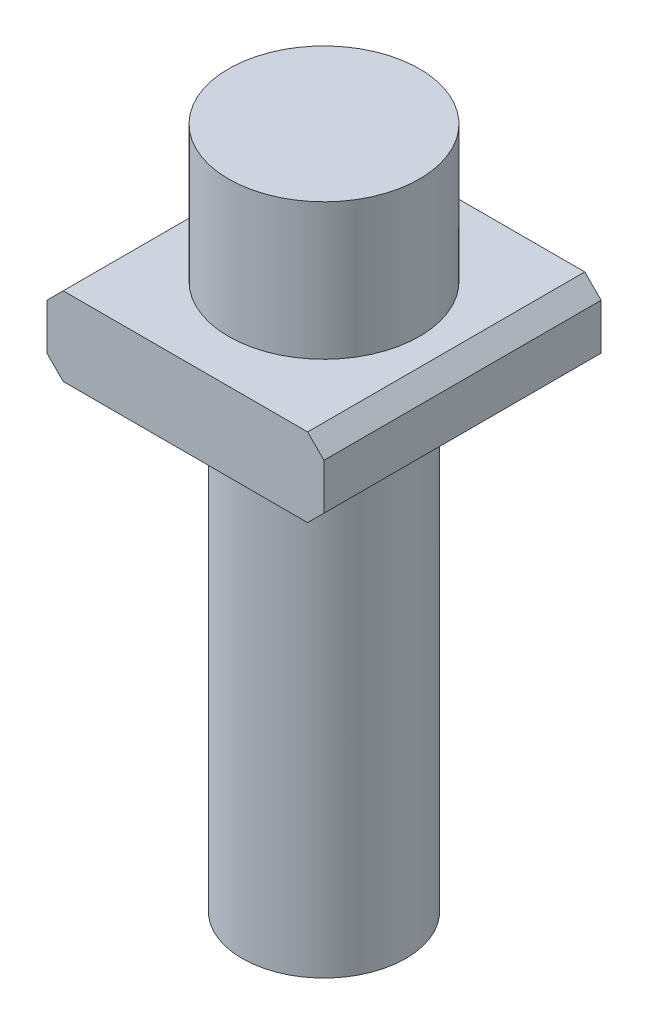
ISO-10303-21;
HEADER;
FILE_DESCRIPTION(('STEP AP214'),'2;1');
FILE_NAME('part.step','',(''),(''),'','','');
FILE_SCHEMA(('AUTOMOTIVE_DESIGN { 1 0 10303 214 1 1 1 1 }'));
ENDSEC;
DATA;
#1=APPLICATION_CONTEXT('core data for automotive mechanical design processes');
#2=APPLICATION_PROTOCOL_DEFINITION('international standard','automotive_design',2000,#1);
#3=PRODUCT_CONTEXT('',#1,'mechanical');
#4=PRODUCT('Part','Part','',(#3));
#5=PRODUCT_RELATED_PRODUCT_CATEGORY('part','',(#4));
#6=PRODUCT_DEFINITION_FORMATION('','',#4);
#7=PRODUCT_DEFINITION_CONTEXT('part definition',#1,'design');
#8=PRODUCT_DEFINITION('design','',#6,#7);
#9=PRODUCT_DEFINITION_SHAPE('','',#8);
#10=(LENGTH_UNIT() NAMED_UNIT(*) SI_UNIT(.MILLI.,.METRE.));
#11=(NAMED_UNIT(*) PLANE_ANGLE_UNIT() SI_UNIT($,.RADIAN.));
#12=(NAMED_UNIT(*) SI_UNIT($,.STERADIAN.) SOLID_ANGLE_UNIT());
#13=UNCERTAINTY_MEASURE_WITH_UNIT(LENGTH_MEASURE(1.E-05),#10,'distance_accuracy_value','');
#14=(GEOMETRIC_REPRESENTATION_CONTEXT(3) GLOBAL_UNCERTAINTY_ASSIGNED_CONTEXT((#13)) GLOBAL_UNIT_ASSIGNED_CONTEXT((#10,
#11,#12)) REPRESENTATION_CONTEXT('',''));
#15=CARTESIAN_POINT('',(0.,0.,0.));
#16=DIRECTION('',(0.,0.,1.));
#17=DIRECTION('',(1.,0.,0.));
#18=AXIS2_PLACEMENT_3D('',#15,#16,#17);
#19=CARTESIAN_POINT('',(-2.54,1.44,-2.54));
#20=DIRECTION('',(1.,0.,0.));
#21=DIRECTION('',(0.,0.,-1.));
#22=AXIS2_PLACEMENT_3D('',#19,#20,#21);
#23=PLANE('',#22);
#24=DIRECTION('',(0.,-1.,0.));
#25=VECTOR('',#24,1.);
#26=CARTESIAN_POINT('',(-2.54,1.44,2.54));
#27=LINE('',#26,#25);
#28=CARTESIAN_POINT('',(-2.54,1.14,2.54));
#29=VERTEX_POINT('',#28);
#30=CARTESIAN_POINT('',(-2.54,0.300000000000002,2.54));
#31=VERTEX_POINT('',#30);
#32=EDGE_CURVE('E151',#29,#31,#27,.T.);
#33=ORIENTED_EDGE('',*,*,#32,.F.);
#34=DIRECTION('',(0.,0.,-1.));
#35=VECTOR('',#34,1.);
#36=CARTESIAN_POINT('',(-2.54,1.14,-2.54));
#37=LINE('',#36,#35);
#38=CARTESIAN_POINT('',(-2.54,1.14,-2.54));
#39=VERTEX_POINT('',#38);
#40=EDGE_CURVE('E11',#29,#39,#37,.T.);
#41=ORIENTED_EDGE('',*,*,#40,.T.);
#42=DIRECTION('',(0.,-1.,0.));
#43=VECTOR('',#42,1.);
#44=CARTESIAN_POINT('',(-2.54,1.44,-2.54));
#45=LINE('',#44,#43);
#46=CARTESIAN_POINT('',(-2.54,0.300000000000002,-2.54));
#47=VERTEX_POINT('',#46);
#48=EDGE_CURVE('E120',#39,#47,#45,.T.);
#49=ORIENTED_EDGE('',*,*,#48,.T.);
#50=DIRECTION('',(0.,0.,1.));
#51=VECTOR('',#50,1.);
#52=CARTESIAN_POINT('',(-2.54,0.300000000000002,-2.54));
#53=LINE('',#52,#51);
#54=EDGE_CURVE('E41',#47,#31,#53,.T.);
#55=ORIENTED_EDGE('',*,*,#54,.T.);
#56=EDGE_LOOP('',(#33,#41,#49,#55));
#57=FACE_BOUND('',#56,.T.);
#58=ADVANCED_FACE('F33',(#57),#23,.F.);
#59=CARTESIAN_POINT('',(-2.54,1.44,2.54));
#60=DIRECTION('',(0.,0.,-1.));
#61=DIRECTION('',(-1.,0.,0.));
#62=AXIS2_PLACEMENT_3D('',#59,#60,#61);
#63=PLANE('',#62);
#64=DIRECTION('',(0.,-1.,0.));
#65=VECTOR('',#64,1.);
#66=CARTESIAN_POINT('',(2.54,1.44,2.54));
#67=LINE('',#66,#65);
#68=CARTESIAN_POINT('',(2.54,1.14,2.54));
#69=VERTEX_POINT('',#68);
#70=CARTESIAN_POINT('',(2.54,0.3,2.54));
#71=VERTEX_POINT('',#70);
#72=EDGE_CURVE('E119',#69,#71,#67,.T.);
#73=ORIENTED_EDGE('',*,*,#72,.F.);
#74=DIRECTION('',(0.707106781186549,-0.707106781186546,0.));
#75=VECTOR('',#74,1.);
#76=CARTESIAN_POINT('',(2.54,1.14,2.54));
#77=LINE('',#76,#75);
#78=CARTESIAN_POINT('',(2.24,1.44,2.54));
#79=VERTEX_POINT('',#78);
#80=EDGE_CURVE('E123',#69,#79,#77,.F.);
#81=ORIENTED_EDGE('',*,*,#80,.T.);
#82=DIRECTION('',(1.,0.,0.));
#83=VECTOR('',#82,1.);
#84=CARTESIAN_POINT('',(-2.54,1.44,2.54));
#85=LINE('',#84,#83);
#86=CARTESIAN_POINT('',(-2.24,1.44,2.54));
#87=VERTEX_POINT('',#86);
#88=EDGE_CURVE('E167',#87,#79,#85,.T.);
#89=ORIENTED_EDGE('',*,*,#88,.F.);
#90=DIRECTION('',(-0.707106781186547,-0.707106781186548,0.));
#91=VECTOR('',#90,1.);
#92=CARTESIAN_POINT('',(-2.24,1.44,2.54));
#93=LINE('',#92,#91);
#94=EDGE_CURVE('E126',#87,#29,#93,.T.);
#95=ORIENTED_EDGE('',*,*,#94,.T.);
#96=ORIENTED_EDGE('',*,*,#32,.T.);
#97=DIRECTION('',(-0.707106781186549,0.707106781186546,0.));
#98=VECTOR('',#97,1.);
#99=CARTESIAN_POINT('',(-2.54,0.300000000000002,2.54));
#100=LINE('',#99,#98);
#101=CARTESIAN_POINT('',(-2.24,0.,2.54));
#102=VERTEX_POINT('',#101);
#103=EDGE_CURVE('E124',#31,#102,#100,.F.);
#104=ORIENTED_EDGE('',*,*,#103,.T.);
#105=DIRECTION('',(1.,0.,0.));
#106=VECTOR('',#105,1.);
#107=CARTESIAN_POINT('',(-2.54,0.,2.54));
#108=LINE('',#107,#106);
#109=CARTESIAN_POINT('',(2.24,0.,2.54));
#110=VERTEX_POINT('',#109);
#111=EDGE_CURVE('E168',#102,#110,#108,.T.);
#112=ORIENTED_EDGE('',*,*,#111,.T.);
#113=DIRECTION('',(0.707106781186547,0.707106781186548,0.));
#114=VECTOR('',#113,1.);
#115=CARTESIAN_POINT('',(2.24,0.,2.54));
#116=LINE('',#115,#114);
#117=EDGE_CURVE('E133',#110,#71,#116,.T.);
#118=ORIENTED_EDGE('',*,*,#117,.T.);
#119=EDGE_LOOP('',(#73,#81,#89,#95,#96,#104,#112,#118));
#120=FACE_BOUND('',#119,.T.);
#121=ADVANCED_FACE('F154',(#120),#63,.F.);
#122=CARTESIAN_POINT('',(2.54,1.44,-2.54));
#123=DIRECTION('',(1.,0.,0.));
#124=DIRECTION('',(0.,0.,-1.));
#125=AXIS2_PLACEMENT_3D('',#122,#123,#124);
#126=PLANE('',#125);
#127=DIRECTION('',(0.,-1.,0.));
#128=VECTOR('',#127,1.);
#129=CARTESIAN_POINT('',(2.54,1.44,-2.54));
#130=LINE('',#129,#128);
#131=CARTESIAN_POINT('',(2.54,1.14,-2.54));
#132=VERTEX_POINT('',#131);
#133=CARTESIAN_POINT('',(2.54,0.3,-2.54));
#134=VERTEX_POINT('',#133);
#135=EDGE_CURVE('E101',#132,#134,#130,.T.);
#136=ORIENTED_EDGE('',*,*,#135,.F.);
#137=DIRECTION('',(0.,0.,1.));
#138=VECTOR('',#137,1.);
#139=CARTESIAN_POINT('',(2.54,1.14,-2.54));
#140=LINE('',#139,#138);
#141=EDGE_CURVE('E115',#132,#69,#140,.T.);
#142=ORIENTED_EDGE('',*,*,#141,.T.);
#143=ORIENTED_EDGE('',*,*,#72,.T.);
#144=DIRECTION('',(0.,0.,-1.));
#145=VECTOR('',#144,1.);
#146=CARTESIAN_POINT('',(2.54,0.3,-2.54));
#147=LINE('',#146,#145);
#148=EDGE_CURVE('E118',#71,#134,#147,.T.);
#149=ORIENTED_EDGE('',*,*,#148,.T.);
#150=EDGE_LOOP('',(#136,#142,#143,#149));
#151=FACE_BOUND('',#150,.T.);
#152=ADVANCED_FACE('F113',(#151),#126,.T.);
#153=CARTESIAN_POINT('',(-2.54,1.44,-2.54));
#154=DIRECTION('',(0.,0.,-1.));
#155=DIRECTION('',(-1.,0.,0.));
#156=AXIS2_PLACEMENT_3D('',#153,#154,#155);
#157=PLANE('',#156);
#158=DIRECTION('',(1.,0.,0.));
#159=VECTOR('',#158,1.);
#160=CARTESIAN_POINT('',(-2.54,1.44,-2.54));
#161=LINE('',#160,#159);
#162=CARTESIAN_POINT('',(-2.24,1.44,-2.54));
#163=VERTEX_POINT('',#162);
#164=CARTESIAN_POINT('',(2.24,1.44,-2.54));
#165=VERTEX_POINT('',#164);
#166=EDGE_CURVE('E104',#163,#165,#161,.T.);
#167=ORIENTED_EDGE('',*,*,#166,.T.);
#168=DIRECTION('',(-0.707106781186549,0.707106781186546,0.));
#169=VECTOR('',#168,1.);
#170=CARTESIAN_POINT('',(-0.150000000000012,3.83,-2.54));
#171=LINE('',#170,#169);
#172=EDGE_CURVE('E98',#165,#132,#171,.F.);
#173=ORIENTED_EDGE('',*,*,#172,.T.);
#174=ORIENTED_EDGE('',*,*,#135,.T.);
#175=DIRECTION('',(-0.707106781186547,-0.707106781186548,0.));
#176=VECTOR('',#175,1.);
#177=CARTESIAN_POINT('',(0.570000000000003,-1.67,-2.54));
#178=LINE('',#177,#176);
#179=CARTESIAN_POINT('',(2.24,0.,-2.54));
#180=VERTEX_POINT('',#179);
#181=EDGE_CURVE('E109',#134,#180,#178,.T.);
#182=ORIENTED_EDGE('',*,*,#181,.T.);
#183=DIRECTION('',(1.,0.,0.));
#184=VECTOR('',#183,1.);
#185=CARTESIAN_POINT('',(-2.54,0.,-2.54));
#186=LINE('',#185,#184);
#187=CARTESIAN_POINT('',(-2.24,0.,-2.54));
#188=VERTEX_POINT('',#187);
#189=EDGE_CURVE('E164',#188,#180,#186,.T.);
#190=ORIENTED_EDGE('',*,*,#189,.F.);
#191=DIRECTION('',(0.707106781186549,-0.707106781186546,0.));
#192=VECTOR('',#191,1.);
#193=CARTESIAN_POINT('',(-3.11,0.869999999999999,-2.54));
#194=LINE('',#193,#192);
#195=EDGE_CURVE('E48',#188,#47,#194,.F.);
#196=ORIENTED_EDGE('',*,*,#195,.T.);
#197=ORIENTED_EDGE('',*,*,#48,.F.);
#198=DIRECTION('',(0.707106781186547,0.707106781186548,0.));
#199=VECTOR('',#198,1.);
#200=CARTESIAN_POINT('',(-2.39,1.29,-2.54));
#201=LINE('',#200,#199);
#202=EDGE_CURVE('E142',#39,#163,#201,.T.);
#203=ORIENTED_EDGE('',*,*,#202,.T.);
#204=EDGE_LOOP('',(#167,#173,#174,#182,#190,#196,#197,#203));
#205=FACE_BOUND('',#204,.T.);
#206=ADVANCED_FACE('F100',(#205),#157,.T.);
#207=CARTESIAN_POINT('',(0.,1.44,0.));
#208=DIRECTION('',(0.,1.,0.));
#209=DIRECTION('',(0.,0.,1.));
#210=AXIS2_PLACEMENT_3D('',#207,#208,#209);
#211=PLANE('',#210);
#212=CARTESIAN_POINT('',(0.,1.44,0.));
#213=DIRECTION('',(0.,1.,0.));
#214=DIRECTION('',(0.,0.,1.));
#215=AXIS2_PLACEMENT_3D('',#212,#213,#214);
#216=CIRCLE('',#215,1.75);
#217=CARTESIAN_POINT('',(0.,1.44,1.75));
#218=VERTEX_POINT('',#217);
#219=EDGE_CURVE('E128',#218,#218,#216,.T.);
#220=ORIENTED_EDGE('',*,*,#219,.F.);
#221=EDGE_LOOP('',(#220));
#222=FACE_BOUND('',#221,.T.);
#223=ORIENTED_EDGE('',*,*,#88,.T.);
#224=DIRECTION('',(0.,0.,-1.));
#225=VECTOR('',#224,1.);
#226=CARTESIAN_POINT('',(2.24,1.44,0.));
#227=LINE('',#226,#225);
#228=EDGE_CURVE('E139',#79,#165,#227,.T.);
#229=ORIENTED_EDGE('',*,*,#228,.T.);
#230=ORIENTED_EDGE('',*,*,#166,.F.);
#231=DIRECTION('',(0.,0.,1.));
#232=VECTOR('',#231,1.);
#233=CARTESIAN_POINT('',(-2.24,1.44,2.54));
#234=LINE('',#233,#232);
#235=EDGE_CURVE('E136',#163,#87,#234,.T.);
#236=ORIENTED_EDGE('',*,*,#235,.T.);
#237=EDGE_LOOP('',(#223,#229,#230,#236));
#238=FACE_BOUND('',#237,.T.);
#239=ADVANCED_FACE('F191',(#222,#238),#211,.T.);
#240=CARTESIAN_POINT('',(0.,0.,0.));
#241=DIRECTION('',(0.,1.,0.));
#242=DIRECTION('',(0.,0.,1.));
#243=AXIS2_PLACEMENT_3D('',#240,#241,#242);
#244=PLANE('',#243);
#245=CARTESIAN_POINT('',(0.,0.,0.));
#246=DIRECTION('',(0.,1.,0.));
#247=DIRECTION('',(0.,0.,1.));
#248=AXIS2_PLACEMENT_3D('',#245,#246,#247);
#249=CIRCLE('',#248,1.5);
#250=CARTESIAN_POINT('',(0.,0.,1.5));
#251=VERTEX_POINT('',#250);
#252=EDGE_CURVE('E158',#251,#251,#249,.F.);
#253=ORIENTED_EDGE('',*,*,#252,.F.);
#254=EDGE_LOOP('',(#253));
#255=FACE_BOUND('',#254,.T.);
#256=ORIENTED_EDGE('',*,*,#189,.T.);
#257=DIRECTION('',(0.,0.,1.));
#258=VECTOR('',#257,1.);
#259=CARTESIAN_POINT('',(2.24,0.,2.54));
#260=LINE('',#259,#258);
#261=EDGE_CURVE('E146',#180,#110,#260,.T.);
#262=ORIENTED_EDGE('',*,*,#261,.T.);
#263=ORIENTED_EDGE('',*,*,#111,.F.);
#264=DIRECTION('',(0.,0.,-1.));
#265=VECTOR('',#264,1.);
#266=CARTESIAN_POINT('',(-2.24,0.,0.));
#267=LINE('',#266,#265);
#268=EDGE_CURVE('E108',#102,#188,#267,.T.);
#269=ORIENTED_EDGE('',*,*,#268,.T.);
#270=EDGE_LOOP('',(#256,#262,#263,#269));
#271=FACE_BOUND('',#270,.T.);
#272=ADVANCED_FACE('F194',(#255,#271),#244,.F.);
#273=CARTESIAN_POINT('',(0.,-8.56,0.));
#274=DIRECTION('',(0.,1.,0.));
#275=DIRECTION('',(0.,0.,1.));
#276=AXIS2_PLACEMENT_3D('',#273,#274,#275);
#277=CYLINDRICAL_SURFACE('',#276,1.5);
#278=CARTESIAN_POINT('',(0.,-8.56,0.));
#279=DIRECTION('',(0.,-1.,0.));
#280=DIRECTION('',(0.,0.,-1.));
#281=AXIS2_PLACEMENT_3D('',#278,#279,#280);
#282=CIRCLE('',#281,1.5);
#283=CARTESIAN_POINT('',(0.,-8.56,-1.5));
#284=VERTEX_POINT('',#283);
#285=EDGE_CURVE('E170',#284,#284,#282,.T.);
#286=ORIENTED_EDGE('',*,*,#285,.F.);
#287=EDGE_LOOP('',(#286));
#288=FACE_BOUND('',#287,.T.);
#289=ORIENTED_EDGE('',*,*,#252,.T.);
#290=EDGE_LOOP('',(#289));
#291=FACE_BOUND('',#290,.T.);
#292=ADVANCED_FACE('F260',(#288,#291),#277,.T.);
#293=CARTESIAN_POINT('',(0.,-8.56,0.));
#294=DIRECTION('',(0.,-1.,0.));
#295=DIRECTION('',(0.,0.,-1.));
#296=AXIS2_PLACEMENT_3D('',#293,#294,#295);
#297=PLANE('',#296);
#298=ORIENTED_EDGE('',*,*,#285,.T.);
#299=EDGE_LOOP('',(#298));
#300=FACE_BOUND('',#299,.T.);
#301=ADVANCED_FACE('F187',(#300),#297,.T.);
#302=CARTESIAN_POINT('',(0.,3.94,0.));
#303=DIRECTION('',(0.,-1.,0.));
#304=DIRECTION('',(0.,0.,-1.));
#305=AXIS2_PLACEMENT_3D('',#302,#303,#304);
#306=CYLINDRICAL_SURFACE('',#305,1.75);
#307=CARTESIAN_POINT('',(0.,3.94,0.));
#308=DIRECTION('',(0.,1.,0.));
#309=DIRECTION('',(0.,0.,1.));
#310=AXIS2_PLACEMENT_3D('',#307,#308,#309);
#311=CIRCLE('',#310,1.75);
#312=CARTESIAN_POINT('',(0.,3.94,1.75));
#313=VERTEX_POINT('',#312);
#314=EDGE_CURVE('E176',#313,#313,#311,.T.);
#315=ORIENTED_EDGE('',*,*,#314,.F.);
#316=EDGE_LOOP('',(#315));
#317=FACE_BOUND('',#316,.T.);
#318=ORIENTED_EDGE('',*,*,#219,.T.);
#319=EDGE_LOOP('',(#318));
#320=FACE_BOUND('',#319,.T.);
#321=ADVANCED_FACE('F184',(#317,#320),#306,.T.);
#322=CARTESIAN_POINT('',(0.,3.94,0.));
#323=DIRECTION('',(0.,1.,0.));
#324=DIRECTION('',(0.,0.,1.));
#325=AXIS2_PLACEMENT_3D('',#322,#323,#324);
#326=PLANE('',#325);
#327=ORIENTED_EDGE('',*,*,#314,.T.);
#328=EDGE_LOOP('',(#327));
#329=FACE_BOUND('',#328,.T.);
#330=ADVANCED_FACE('F182',(#329),#326,.T.);
#331=CARTESIAN_POINT('',(2.54,1.14,-2.54));
#332=DIRECTION('',(-0.707106781186546,-0.707106781186549,0.));
#333=DIRECTION('',(0.,0.,1.));
#334=AXIS2_PLACEMENT_3D('',#331,#332,#333);
#335=PLANE('',#334);
#336=ORIENTED_EDGE('',*,*,#172,.F.);
#337=ORIENTED_EDGE('',*,*,#228,.F.);
#338=ORIENTED_EDGE('',*,*,#80,.F.);
#339=ORIENTED_EDGE('',*,*,#141,.F.);
#340=EDGE_LOOP('',(#336,#337,#338,#339));
#341=FACE_BOUND('',#340,.T.);
#342=ADVANCED_FACE('F122',(#341),#335,.F.);
#343=CARTESIAN_POINT('',(2.24,0.,0.));
#344=DIRECTION('',(0.707106781186548,-0.707106781186547,0.));
#345=DIRECTION('',(0.,0.,-1.));
#346=AXIS2_PLACEMENT_3D('',#343,#344,#345);
#347=PLANE('',#346);
#348=ORIENTED_EDGE('',*,*,#181,.F.);
#349=ORIENTED_EDGE('',*,*,#148,.F.);
#350=ORIENTED_EDGE('',*,*,#117,.F.);
#351=ORIENTED_EDGE('',*,*,#261,.F.);
#352=EDGE_LOOP('',(#348,#349,#350,#351));
#353=FACE_BOUND('',#352,.T.);
#354=ADVANCED_FACE('F198',(#353),#347,.T.);
#355=CARTESIAN_POINT('',(-2.24,1.44,0.));
#356=DIRECTION('',(-0.707106781186548,0.707106781186547,0.));
#357=DIRECTION('',(0.,0.,-1.));
#358=AXIS2_PLACEMENT_3D('',#355,#356,#357);
#359=PLANE('',#358);
#360=ORIENTED_EDGE('',*,*,#202,.F.);
#361=ORIENTED_EDGE('',*,*,#40,.F.);
#362=ORIENTED_EDGE('',*,*,#94,.F.);
#363=ORIENTED_EDGE('',*,*,#235,.F.);
#364=EDGE_LOOP('',(#360,#361,#362,#363));
#365=FACE_BOUND('',#364,.T.);
#366=ADVANCED_FACE('F203',(#365),#359,.T.);
#367=CARTESIAN_POINT('',(-2.54,0.300000000000002,-2.54));
#368=DIRECTION('',(0.707106781186546,0.707106781186549,0.));
#369=DIRECTION('',(0.,0.,1.));
#370=AXIS2_PLACEMENT_3D('',#367,#368,#369);
#371=PLANE('',#370);
#372=ORIENTED_EDGE('',*,*,#195,.F.);
#373=ORIENTED_EDGE('',*,*,#268,.F.);
#374=ORIENTED_EDGE('',*,*,#103,.F.);
#375=ORIENTED_EDGE('',*,*,#54,.F.);
#376=EDGE_LOOP('',(#372,#373,#374,#375));
#377=FACE_BOUND('',#376,.T.);
#378=ADVANCED_FACE('F35',(#377),#371,.F.);
#379=CLOSED_SHELL('',(#58,#121,#152,#206,#239,#272,#292,#301,#321,#330,#342,#354,#366,#378));
#380=MANIFOLD_SOLID_BREP('B2',#379);
#381=ADVANCED_BREP_SHAPE_REPRESENTATION('',(#18,#380),#14);
#382=SHAPE_DEFINITION_REPRESENTATION(#9,#381);
ENDSEC;
END-ISO-10303-21;
